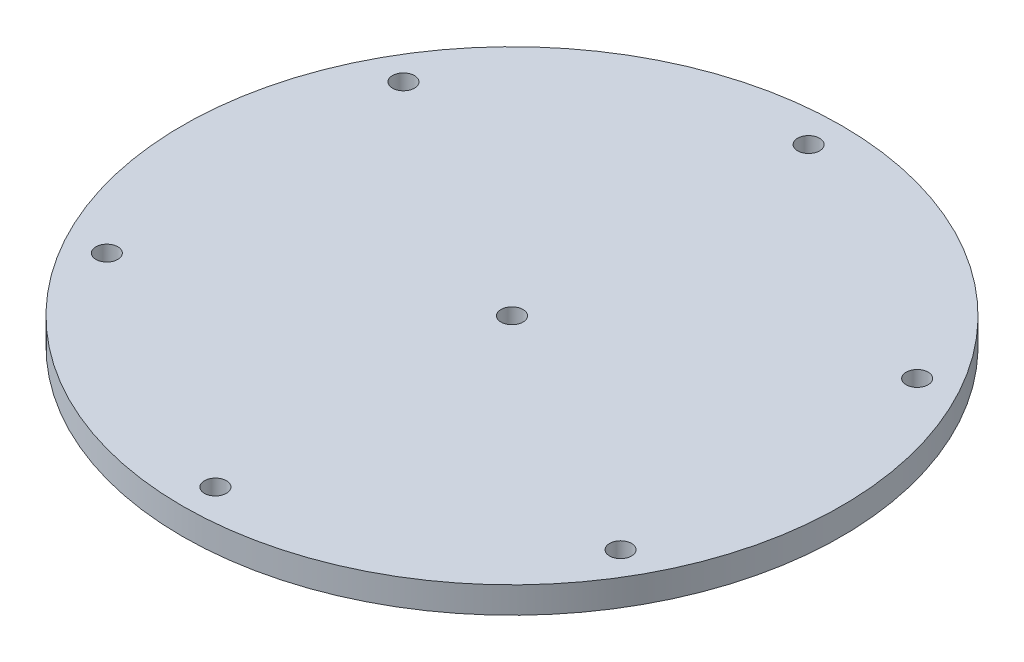
ISO-10303-21;
HEADER;
FILE_DESCRIPTION(('STEP AP214'),'2;1');
FILE_NAME('part.step','',(''),(''),'','','');
FILE_SCHEMA(('AUTOMOTIVE_DESIGN { 1 0 10303 214 1 1 1 1 }'));
ENDSEC;
DATA;
#1=APPLICATION_CONTEXT('core data for automotive mechanical design processes');
#2=APPLICATION_PROTOCOL_DEFINITION('international standard','automotive_design',2000,#1);
#3=PRODUCT_CONTEXT('',#1,'mechanical');
#4=PRODUCT('Part','Part','',(#3));
#5=PRODUCT_RELATED_PRODUCT_CATEGORY('part','',(#4));
#6=PRODUCT_DEFINITION_FORMATION('','',#4);
#7=PRODUCT_DEFINITION_CONTEXT('part definition',#1,'design');
#8=PRODUCT_DEFINITION('design','',#6,#7);
#9=PRODUCT_DEFINITION_SHAPE('','',#8);
#10=(LENGTH_UNIT() NAMED_UNIT(*) SI_UNIT(.MILLI.,.METRE.));
#11=(NAMED_UNIT(*) PLANE_ANGLE_UNIT() SI_UNIT($,.RADIAN.));
#12=(NAMED_UNIT(*) SI_UNIT($,.STERADIAN.) SOLID_ANGLE_UNIT());
#13=UNCERTAINTY_MEASURE_WITH_UNIT(LENGTH_MEASURE(1.E-05),#10,'distance_accuracy_value','');
#14=(GEOMETRIC_REPRESENTATION_CONTEXT(3) GLOBAL_UNCERTAINTY_ASSIGNED_CONTEXT((#13)) GLOBAL_UNIT_ASSIGNED_CONTEXT((#10,
#11,#12)) REPRESENTATION_CONTEXT('',''));
#15=CARTESIAN_POINT('',(0.,0.,0.));
#16=DIRECTION('',(0.,0.,1.));
#17=DIRECTION('',(1.,0.,0.));
#18=AXIS2_PLACEMENT_3D('',#15,#16,#17);
#19=CARTESIAN_POINT('',(0.,6.,0.));
#20=DIRECTION('',(0.,1.,0.));
#21=DIRECTION('',(0.,0.,1.));
#22=AXIS2_PLACEMENT_3D('',#19,#20,#21);
#23=PLANE('',#22);
#24=CARTESIAN_POINT('',(-58.4567147554453,6.,33.7500000000025));
#25=DIRECTION('',(0.,1.,0.));
#26=DIRECTION('',(0.,0.,1.));
#27=AXIS2_PLACEMENT_3D('',#24,#25,#26);
#28=CIRCLE('',#27,2.5);
#29=CARTESIAN_POINT('',(-58.4567147554453,6.,36.2500000000025));
#30=VERTEX_POINT('',#29);
#31=EDGE_CURVE('E71',#30,#30,#28,.T.);
#32=ORIENTED_EDGE('',*,*,#31,.F.);
#33=EDGE_LOOP('',(#32));
#34=FACE_BOUND('',#33,.T.);
#35=CARTESIAN_POINT('',(58.4567147554539,6.,33.7499999999975));
#36=DIRECTION('',(0.,1.,0.));
#37=DIRECTION('',(0.,0.,1.));
#38=AXIS2_PLACEMENT_3D('',#35,#36,#37);
#39=CIRCLE('',#38,2.5);
#40=CARTESIAN_POINT('',(58.4567147554539,6.,36.2499999999975));
#41=VERTEX_POINT('',#40);
#42=EDGE_CURVE('E59',#41,#41,#39,.T.);
#43=ORIENTED_EDGE('',*,*,#42,.F.);
#44=EDGE_LOOP('',(#43));
#45=FACE_BOUND('',#44,.T.);
#46=CARTESIAN_POINT('',(0.,6.,0.));
#47=DIRECTION('',(0.,1.,0.));
#48=DIRECTION('',(0.,0.,1.));
#49=AXIS2_PLACEMENT_3D('',#46,#47,#48);
#50=CIRCLE('',#49,2.5);
#51=CARTESIAN_POINT('',(0.,6.,2.5));
#52=VERTEX_POINT('',#51);
#53=EDGE_CURVE('E47',#52,#52,#50,.T.);
#54=ORIENTED_EDGE('',*,*,#53,.F.);
#55=EDGE_LOOP('',(#54));
#56=FACE_BOUND('',#55,.T.);
#57=CARTESIAN_POINT('',(0.,6.,0.));
#58=DIRECTION('',(0.,1.,0.));
#59=DIRECTION('',(0.,0.,1.));
#60=AXIS2_PLACEMENT_3D('',#57,#58,#59);
#61=CIRCLE('',#60,75.);
#62=CARTESIAN_POINT('',(0.,6.,75.));
#63=VERTEX_POINT('',#62);
#64=EDGE_CURVE('E10',#63,#63,#61,.T.);
#65=ORIENTED_EDGE('',*,*,#64,.T.);
#66=EDGE_LOOP('',(#65));
#67=FACE_BOUND('',#66,.T.);
#68=CARTESIAN_POINT('',(0.,6.,-67.5));
#69=DIRECTION('',(0.,1.,0.));
#70=DIRECTION('',(0.,0.,1.));
#71=AXIS2_PLACEMENT_3D('',#68,#69,#70);
#72=CIRCLE('',#71,2.5);
#73=CARTESIAN_POINT('',(0.,6.,-65.));
#74=VERTEX_POINT('',#73);
#75=EDGE_CURVE('E42',#74,#74,#72,.T.);
#76=ORIENTED_EDGE('',*,*,#75,.F.);
#77=EDGE_LOOP('',(#76));
#78=FACE_BOUND('',#77,.T.);
#79=CARTESIAN_POINT('',(58.456714755451,6.,-33.7500000000025));
#80=DIRECTION('',(0.,1.,0.));
#81=DIRECTION('',(0.,0.,1.));
#82=AXIS2_PLACEMENT_3D('',#79,#80,#81);
#83=CIRCLE('',#82,2.5);
#84=CARTESIAN_POINT('',(58.456714755451,6.,-31.2500000000025));
#85=VERTEX_POINT('',#84);
#86=EDGE_CURVE('E53',#85,#85,#83,.T.);
#87=ORIENTED_EDGE('',*,*,#86,.F.);
#88=EDGE_LOOP('',(#87));
#89=FACE_BOUND('',#88,.T.);
#90=CARTESIAN_POINT('',(5.73059706197408E-12,6.,67.5));
#91=DIRECTION('',(0.,1.,0.));
#92=DIRECTION('',(0.,0.,1.));
#93=AXIS2_PLACEMENT_3D('',#90,#91,#92);
#94=CIRCLE('',#93,2.5);
#95=CARTESIAN_POINT('',(5.73059706197408E-12,6.,70.));
#96=VERTEX_POINT('',#95);
#97=EDGE_CURVE('E65',#96,#96,#94,.T.);
#98=ORIENTED_EDGE('',*,*,#97,.F.);
#99=EDGE_LOOP('',(#98));
#100=FACE_BOUND('',#99,.T.);
#101=CARTESIAN_POINT('',(-58.4567147554482,6.,-33.7499999999975));
#102=DIRECTION('',(0.,1.,0.));
#103=DIRECTION('',(0.,0.,1.));
#104=AXIS2_PLACEMENT_3D('',#101,#102,#103);
#105=CIRCLE('',#104,2.5);
#106=CARTESIAN_POINT('',(-58.4567147554482,6.,-31.2499999999975));
#107=VERTEX_POINT('',#106);
#108=EDGE_CURVE('E77',#107,#107,#105,.T.);
#109=ORIENTED_EDGE('',*,*,#108,.F.);
#110=EDGE_LOOP('',(#109));
#111=FACE_BOUND('',#110,.T.);
#112=ADVANCED_FACE('F31',(#34,#45,#56,#67,#78,#89,#100,#111),#23,.T.);
#113=CARTESIAN_POINT('',(0.,0.,0.));
#114=DIRECTION('',(0.,1.,0.));
#115=DIRECTION('',(0.,0.,1.));
#116=AXIS2_PLACEMENT_3D('',#113,#114,#115);
#117=PLANE('',#116);
#118=CARTESIAN_POINT('',(0.,0.,0.));
#119=DIRECTION('',(0.,1.,0.));
#120=DIRECTION('',(0.,0.,1.));
#121=AXIS2_PLACEMENT_3D('',#118,#119,#120);
#122=CIRCLE('',#121,75.);
#123=CARTESIAN_POINT('',(0.,0.,75.));
#124=VERTEX_POINT('',#123);
#125=EDGE_CURVE('E35',#124,#124,#122,.T.);
#126=ORIENTED_EDGE('',*,*,#125,.F.);
#127=EDGE_LOOP('',(#126));
#128=FACE_BOUND('',#127,.T.);
#129=CARTESIAN_POINT('',(0.,0.,-67.5));
#130=DIRECTION('',(0.,1.,0.));
#131=DIRECTION('',(0.,0.,1.));
#132=AXIS2_PLACEMENT_3D('',#129,#130,#131);
#133=CIRCLE('',#132,2.5);
#134=CARTESIAN_POINT('',(0.,0.,-65.));
#135=VERTEX_POINT('',#134);
#136=EDGE_CURVE('E44',#135,#135,#133,.T.);
#137=ORIENTED_EDGE('',*,*,#136,.T.);
#138=EDGE_LOOP('',(#137));
#139=FACE_BOUND('',#138,.T.);
#140=CARTESIAN_POINT('',(0.,0.,0.));
#141=DIRECTION('',(0.,1.,0.));
#142=DIRECTION('',(0.,0.,1.));
#143=AXIS2_PLACEMENT_3D('',#140,#141,#142);
#144=CIRCLE('',#143,2.5);
#145=CARTESIAN_POINT('',(0.,0.,2.5));
#146=VERTEX_POINT('',#145);
#147=EDGE_CURVE('E50',#146,#146,#144,.T.);
#148=ORIENTED_EDGE('',*,*,#147,.T.);
#149=EDGE_LOOP('',(#148));
#150=FACE_BOUND('',#149,.T.);
#151=CARTESIAN_POINT('',(58.456714755451,0.,-33.7500000000025));
#152=DIRECTION('',(0.,1.,0.));
#153=DIRECTION('',(0.,0.,1.));
#154=AXIS2_PLACEMENT_3D('',#151,#152,#153);
#155=CIRCLE('',#154,2.5);
#156=CARTESIAN_POINT('',(58.456714755451,0.,-31.2500000000025));
#157=VERTEX_POINT('',#156);
#158=EDGE_CURVE('E56',#157,#157,#155,.T.);
#159=ORIENTED_EDGE('',*,*,#158,.T.);
#160=EDGE_LOOP('',(#159));
#161=FACE_BOUND('',#160,.T.);
#162=CARTESIAN_POINT('',(58.4567147554539,0.,33.7499999999975));
#163=DIRECTION('',(0.,1.,0.));
#164=DIRECTION('',(0.,0.,1.));
#165=AXIS2_PLACEMENT_3D('',#162,#163,#164);
#166=CIRCLE('',#165,2.5);
#167=CARTESIAN_POINT('',(58.4567147554539,0.,36.2499999999975));
#168=VERTEX_POINT('',#167);
#169=EDGE_CURVE('E62',#168,#168,#166,.T.);
#170=ORIENTED_EDGE('',*,*,#169,.T.);
#171=EDGE_LOOP('',(#170));
#172=FACE_BOUND('',#171,.T.);
#173=CARTESIAN_POINT('',(5.73059706197408E-12,0.,67.5));
#174=DIRECTION('',(0.,1.,0.));
#175=DIRECTION('',(0.,0.,1.));
#176=AXIS2_PLACEMENT_3D('',#173,#174,#175);
#177=CIRCLE('',#176,2.5);
#178=CARTESIAN_POINT('',(5.73059706197408E-12,0.,70.));
#179=VERTEX_POINT('',#178);
#180=EDGE_CURVE('E68',#179,#179,#177,.T.);
#181=ORIENTED_EDGE('',*,*,#180,.T.);
#182=EDGE_LOOP('',(#181));
#183=FACE_BOUND('',#182,.T.);
#184=CARTESIAN_POINT('',(-58.4567147554453,0.,33.7500000000025));
#185=DIRECTION('',(0.,1.,0.));
#186=DIRECTION('',(0.,0.,1.));
#187=AXIS2_PLACEMENT_3D('',#184,#185,#186);
#188=CIRCLE('',#187,2.5);
#189=CARTESIAN_POINT('',(-58.4567147554453,0.,36.2500000000025));
#190=VERTEX_POINT('',#189);
#191=EDGE_CURVE('E74',#190,#190,#188,.T.);
#192=ORIENTED_EDGE('',*,*,#191,.T.);
#193=EDGE_LOOP('',(#192));
#194=FACE_BOUND('',#193,.T.);
#195=CARTESIAN_POINT('',(-58.4567147554482,0.,-33.7499999999975));
#196=DIRECTION('',(0.,1.,0.));
#197=DIRECTION('',(0.,0.,1.));
#198=AXIS2_PLACEMENT_3D('',#195,#196,#197);
#199=CIRCLE('',#198,2.5);
#200=CARTESIAN_POINT('',(-58.4567147554482,0.,-31.2499999999975));
#201=VERTEX_POINT('',#200);
#202=EDGE_CURVE('E80',#201,#201,#199,.T.);
#203=ORIENTED_EDGE('',*,*,#202,.T.);
#204=EDGE_LOOP('',(#203));
#205=FACE_BOUND('',#204,.T.);
#206=ADVANCED_FACE('F90',(#128,#139,#150,#161,#172,#183,#194,#205),#117,.F.);
#207=CARTESIAN_POINT('',(0.,6.,0.));
#208=DIRECTION('',(0.,-1.,0.));
#209=DIRECTION('',(0.,0.,-1.));
#210=AXIS2_PLACEMENT_3D('',#207,#208,#209);
#211=CYLINDRICAL_SURFACE('',#210,75.);
#212=ORIENTED_EDGE('',*,*,#64,.F.);
#213=EDGE_LOOP('',(#212));
#214=FACE_BOUND('',#213,.T.);
#215=ORIENTED_EDGE('',*,*,#125,.T.);
#216=EDGE_LOOP('',(#215));
#217=FACE_BOUND('',#216,.T.);
#218=ADVANCED_FACE('F33',(#214,#217),#211,.T.);
#219=CARTESIAN_POINT('',(0.,6.,-67.5));
#220=DIRECTION('',(0.,-1.,0.));
#221=DIRECTION('',(0.,0.,-1.));
#222=AXIS2_PLACEMENT_3D('',#219,#220,#221);
#223=CYLINDRICAL_SURFACE('',#222,2.5);
#224=ORIENTED_EDGE('',*,*,#75,.T.);
#225=EDGE_LOOP('',(#224));
#226=FACE_BOUND('',#225,.T.);
#227=ORIENTED_EDGE('',*,*,#136,.F.);
#228=EDGE_LOOP('',(#227));
#229=FACE_BOUND('',#228,.T.);
#230=ADVANCED_FACE('F100',(#226,#229),#223,.F.);
#231=CARTESIAN_POINT('',(0.,6.,0.));
#232=DIRECTION('',(0.,-1.,0.));
#233=DIRECTION('',(0.,0.,-1.));
#234=AXIS2_PLACEMENT_3D('',#231,#232,#233);
#235=CYLINDRICAL_SURFACE('',#234,2.5);
#236=ORIENTED_EDGE('',*,*,#53,.T.);
#237=EDGE_LOOP('',(#236));
#238=FACE_BOUND('',#237,.T.);
#239=ORIENTED_EDGE('',*,*,#147,.F.);
#240=EDGE_LOOP('',(#239));
#241=FACE_BOUND('',#240,.T.);
#242=ADVANCED_FACE('F103',(#238,#241),#235,.F.);
#243=CARTESIAN_POINT('',(58.456714755451,6.,-33.7500000000025));
#244=DIRECTION('',(0.,-1.,0.));
#245=DIRECTION('',(0.,0.,-1.));
#246=AXIS2_PLACEMENT_3D('',#243,#244,#245);
#247=CYLINDRICAL_SURFACE('',#246,2.5);
#248=ORIENTED_EDGE('',*,*,#86,.T.);
#249=EDGE_LOOP('',(#248));
#250=FACE_BOUND('',#249,.T.);
#251=ORIENTED_EDGE('',*,*,#158,.F.);
#252=EDGE_LOOP('',(#251));
#253=FACE_BOUND('',#252,.T.);
#254=ADVANCED_FACE('F107',(#250,#253),#247,.F.);
#255=CARTESIAN_POINT('',(58.4567147554539,6.,33.7499999999975));
#256=DIRECTION('',(0.,-1.,0.));
#257=DIRECTION('',(0.,0.,-1.));
#258=AXIS2_PLACEMENT_3D('',#255,#256,#257);
#259=CYLINDRICAL_SURFACE('',#258,2.5);
#260=ORIENTED_EDGE('',*,*,#42,.T.);
#261=EDGE_LOOP('',(#260));
#262=FACE_BOUND('',#261,.T.);
#263=ORIENTED_EDGE('',*,*,#169,.F.);
#264=EDGE_LOOP('',(#263));
#265=FACE_BOUND('',#264,.T.);
#266=ADVANCED_FACE('F111',(#262,#265),#259,.F.);
#267=CARTESIAN_POINT('',(5.73059706197408E-12,6.,67.5));
#268=DIRECTION('',(0.,-1.,0.));
#269=DIRECTION('',(0.,0.,-1.));
#270=AXIS2_PLACEMENT_3D('',#267,#268,#269);
#271=CYLINDRICAL_SURFACE('',#270,2.5);
#272=ORIENTED_EDGE('',*,*,#97,.T.);
#273=EDGE_LOOP('',(#272));
#274=FACE_BOUND('',#273,.T.);
#275=ORIENTED_EDGE('',*,*,#180,.F.);
#276=EDGE_LOOP('',(#275));
#277=FACE_BOUND('',#276,.T.);
#278=ADVANCED_FACE('F115',(#274,#277),#271,.F.);
#279=CARTESIAN_POINT('',(-58.4567147554453,6.,33.7500000000025));
#280=DIRECTION('',(0.,-1.,0.));
#281=DIRECTION('',(0.,0.,-1.));
#282=AXIS2_PLACEMENT_3D('',#279,#280,#281);
#283=CYLINDRICAL_SURFACE('',#282,2.5);
#284=ORIENTED_EDGE('',*,*,#31,.T.);
#285=EDGE_LOOP('',(#284));
#286=FACE_BOUND('',#285,.T.);
#287=ORIENTED_EDGE('',*,*,#191,.F.);
#288=EDGE_LOOP('',(#287));
#289=FACE_BOUND('',#288,.T.);
#290=ADVANCED_FACE('F119',(#286,#289),#283,.F.);
#291=CARTESIAN_POINT('',(-58.4567147554482,6.,-33.7499999999975));
#292=DIRECTION('',(0.,-1.,0.));
#293=DIRECTION('',(0.,0.,-1.));
#294=AXIS2_PLACEMENT_3D('',#291,#292,#293);
#295=CYLINDRICAL_SURFACE('',#294,2.5);
#296=ORIENTED_EDGE('',*,*,#108,.T.);
#297=EDGE_LOOP('',(#296));
#298=FACE_BOUND('',#297,.T.);
#299=ORIENTED_EDGE('',*,*,#202,.F.);
#300=EDGE_LOOP('',(#299));
#301=FACE_BOUND('',#300,.T.);
#302=ADVANCED_FACE('F86',(#298,#301),#295,.F.);
#303=CLOSED_SHELL('',(#112,#206,#218,#230,#242,#254,#266,#278,#290,#302));
#304=MANIFOLD_SOLID_BREP('B2',#303);
#305=ADVANCED_BREP_SHAPE_REPRESENTATION('',(#18,#304),#14);
#306=SHAPE_DEFINITION_REPRESENTATION(#9,#305);
ENDSEC;
END-ISO-10303-21;
